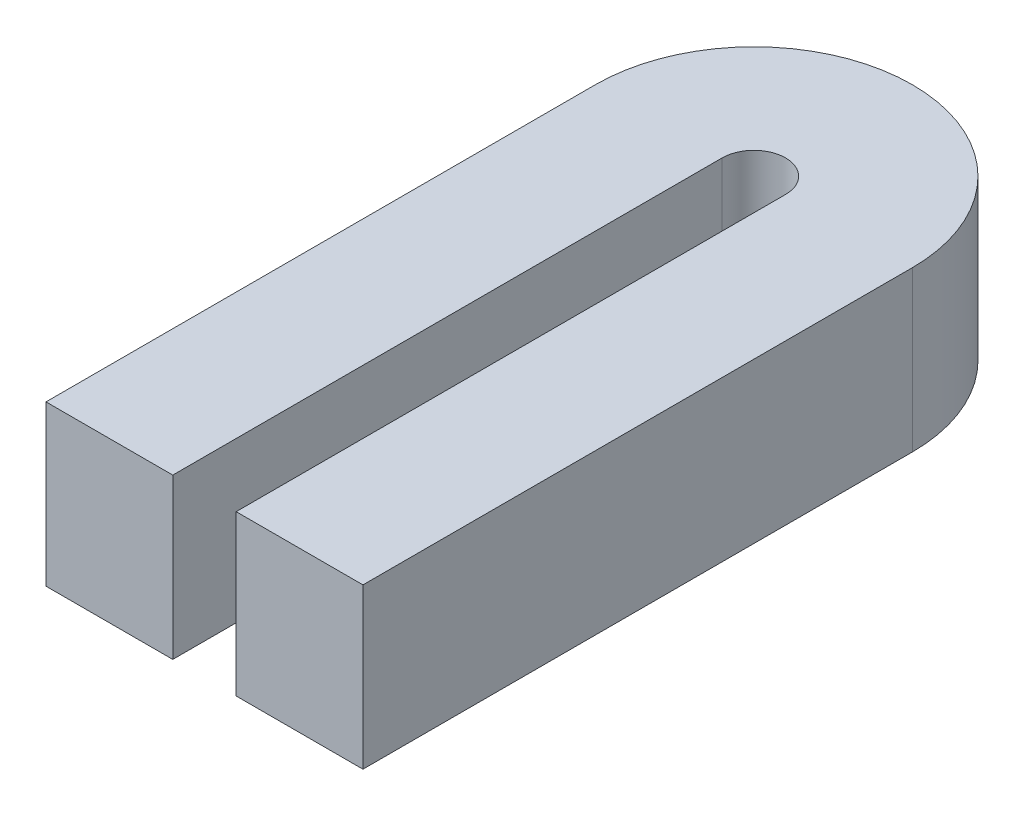
ISO-10303-21;
HEADER;
FILE_DESCRIPTION(('STEP AP214'),'2;1');
FILE_NAME('part.step','',(''),(''),'','','');
FILE_SCHEMA(('AUTOMOTIVE_DESIGN { 1 0 10303 214 1 1 1 1 }'));
ENDSEC;
DATA;
#1=APPLICATION_CONTEXT('core data for automotive mechanical design processes');
#2=APPLICATION_PROTOCOL_DEFINITION('international standard','automotive_design',2000,#1);
#3=PRODUCT_CONTEXT('',#1,'mechanical');
#4=PRODUCT('Part','Part','',(#3));
#5=PRODUCT_RELATED_PRODUCT_CATEGORY('part','',(#4));
#6=PRODUCT_DEFINITION_FORMATION('','',#4);
#7=PRODUCT_DEFINITION_CONTEXT('part definition',#1,'design');
#8=PRODUCT_DEFINITION('design','',#6,#7);
#9=PRODUCT_DEFINITION_SHAPE('','',#8);
#10=(LENGTH_UNIT() NAMED_UNIT(*) SI_UNIT(.MILLI.,.METRE.));
#11=(NAMED_UNIT(*) PLANE_ANGLE_UNIT() SI_UNIT($,.RADIAN.));
#12=(NAMED_UNIT(*) SI_UNIT($,.STERADIAN.) SOLID_ANGLE_UNIT());
#13=UNCERTAINTY_MEASURE_WITH_UNIT(LENGTH_MEASURE(1.E-05),#10,'distance_accuracy_value','');
#14=(GEOMETRIC_REPRESENTATION_CONTEXT(3) GLOBAL_UNCERTAINTY_ASSIGNED_CONTEXT((#13)) GLOBAL_UNIT_ASSIGNED_CONTEXT((#10,
#11,#12)) REPRESENTATION_CONTEXT('',''));
#15=CARTESIAN_POINT('',(0.,0.,0.));
#16=DIRECTION('',(0.,0.,1.));
#17=DIRECTION('',(1.,0.,0.));
#18=AXIS2_PLACEMENT_3D('',#15,#16,#17);
#19=CARTESIAN_POINT('',(1635.16573059091,-302.250162855083,2531.47329857861));
#20=DIRECTION('',(0.,-1.,0.));
#21=DIRECTION('',(0.,0.,-1.));
#22=AXIS2_PLACEMENT_3D('',#19,#20,#21);
#23=PLANE('',#22);
#24=DIRECTION('',(0.,0.,1.));
#25=VECTOR('',#24,1.);
#26=CARTESIAN_POINT('',(1611.5904596891,-302.250162855083,2531.47329857861));
#27=LINE('',#26,#25);
#28=CARTESIAN_POINT('',(1611.5904596891,-302.250162855083,2531.47329857861));
#29=VERTEX_POINT('',#28);
#30=CARTESIAN_POINT('',(1611.5904596891,-302.250162855083,2613.20090437155));
#31=VERTEX_POINT('',#30);
#32=EDGE_CURVE('E11',#29,#31,#27,.T.);
#33=ORIENTED_EDGE('',*,*,#32,.F.);
#34=CARTESIAN_POINT('',(1635.16573059091,-302.250162855083,2531.47329857861));
#35=DIRECTION('',(0.,-1.,0.));
#36=DIRECTION('',(1.,0.,0.));
#37=AXIS2_PLACEMENT_3D('',#34,#35,#36);
#38=CIRCLE('',#37,23.5752709018111);
#39=CARTESIAN_POINT('',(1658.74100149272,-302.250162855083,2531.47329857861));
#40=VERTEX_POINT('',#39);
#41=EDGE_CURVE('E86',#29,#40,#38,.T.);
#42=ORIENTED_EDGE('',*,*,#41,.T.);
#43=DIRECTION('',(0.,0.,1.));
#44=VECTOR('',#43,1.);
#45=CARTESIAN_POINT('',(1658.74100149272,-302.250162855083,2531.47329857861));
#46=LINE('',#45,#44);
#47=CARTESIAN_POINT('',(1658.74100149272,-302.250162855083,2613.20090437155));
#48=VERTEX_POINT('',#47);
#49=EDGE_CURVE('E82',#40,#48,#46,.T.);
#50=ORIENTED_EDGE('',*,*,#49,.T.);
#51=DIRECTION('',(1.,0.,0.));
#52=VECTOR('',#51,1.);
#53=CARTESIAN_POINT('',(1639.88078477127,-302.250162855083,2613.20090437155));
#54=LINE('',#53,#52);
#55=CARTESIAN_POINT('',(1639.88078477127,-302.250162855083,2613.20090437155));
#56=VERTEX_POINT('',#55);
#57=EDGE_CURVE('E98',#56,#48,#54,.T.);
#58=ORIENTED_EDGE('',*,*,#57,.F.);
#59=DIRECTION('',(0.,0.,1.));
#60=VECTOR('',#59,1.);
#61=CARTESIAN_POINT('',(1639.88078477127,-302.250162855083,2531.47329857861));
#62=LINE('',#61,#60);
#63=CARTESIAN_POINT('',(1639.88078477127,-302.250162855083,2531.47329857861));
#64=VERTEX_POINT('',#63);
#65=EDGE_CURVE('E95',#64,#56,#62,.T.);
#66=ORIENTED_EDGE('',*,*,#65,.F.);
#67=CARTESIAN_POINT('',(1635.16573059091,-302.250162855083,2531.47329857861));
#68=DIRECTION('',(0.,-1.,0.));
#69=DIRECTION('',(1.,0.,0.));
#70=AXIS2_PLACEMENT_3D('',#67,#68,#69);
#71=CIRCLE('',#70,4.71505418036223);
#72=CARTESIAN_POINT('',(1630.45067641054,-302.250162855083,2531.47329857861));
#73=VERTEX_POINT('',#72);
#74=EDGE_CURVE('E71',#73,#64,#71,.T.);
#75=ORIENTED_EDGE('',*,*,#74,.F.);
#76=DIRECTION('',(0.,0.,1.));
#77=VECTOR('',#76,1.);
#78=CARTESIAN_POINT('',(1630.45067641054,-302.250162855083,2531.47329857861));
#79=LINE('',#78,#77);
#80=CARTESIAN_POINT('',(1630.45067641054,-302.250162855083,2613.20090437155));
#81=VERTEX_POINT('',#80);
#82=EDGE_CURVE('E63',#73,#81,#79,.T.);
#83=ORIENTED_EDGE('',*,*,#82,.T.);
#84=DIRECTION('',(1.,0.,0.));
#85=VECTOR('',#84,1.);
#86=CARTESIAN_POINT('',(1611.5904596891,-302.250162855083,2613.20090437155));
#87=LINE('',#86,#85);
#88=EDGE_CURVE('E74',#31,#81,#87,.T.);
#89=ORIENTED_EDGE('',*,*,#88,.F.);
#90=EDGE_LOOP('',(#33,#42,#50,#58,#66,#75,#83,#89));
#91=FACE_BOUND('',#90,.T.);
#92=ADVANCED_FACE('F16',(#91),#23,.T.);
#93=CARTESIAN_POINT('',(1635.16573059091,-282.250162855083,2531.47329857861));
#94=DIRECTION('',(0.,-1.,0.));
#95=DIRECTION('',(0.,0.,-1.));
#96=AXIS2_PLACEMENT_3D('',#93,#94,#95);
#97=CYLINDRICAL_SURFACE('',#96,23.5752709018111);
#98=DIRECTION('',(0.,-1.,0.));
#99=VECTOR('',#98,1.);
#100=CARTESIAN_POINT('',(1611.5904596891,-282.250162855083,2531.47329857861));
#101=LINE('',#100,#99);
#102=CARTESIAN_POINT('',(1611.5904596891,-278.499891429945,2531.47329857861));
#103=VERTEX_POINT('',#102);
#104=EDGE_CURVE('E25',#103,#29,#101,.T.);
#105=ORIENTED_EDGE('',*,*,#104,.F.);
#106=CARTESIAN_POINT('',(1635.16573059091,-278.499891429945,2531.47329857861));
#107=DIRECTION('',(0.,1.,0.));
#108=DIRECTION('',(0.,0.,-1.));
#109=AXIS2_PLACEMENT_3D('',#106,#107,#108);
#110=CIRCLE('',#109,23.5752709018111);
#111=CARTESIAN_POINT('',(1658.74100149272,-278.499891429945,2531.47329857861));
#112=VERTEX_POINT('',#111);
#113=EDGE_CURVE('E146',#112,#103,#110,.T.);
#114=ORIENTED_EDGE('',*,*,#113,.F.);
#115=DIRECTION('',(0.,-1.,0.));
#116=VECTOR('',#115,1.);
#117=CARTESIAN_POINT('',(1658.74100149272,-282.250162855083,2531.47329857861));
#118=LINE('',#117,#116);
#119=EDGE_CURVE('E19',#112,#40,#118,.T.);
#120=ORIENTED_EDGE('',*,*,#119,.T.);
#121=ORIENTED_EDGE('',*,*,#41,.F.);
#122=EDGE_LOOP('',(#105,#114,#120,#121));
#123=FACE_BOUND('',#122,.T.);
#124=ADVANCED_FACE('F162',(#123),#97,.T.);
#125=CARTESIAN_POINT('',(1658.74100149272,-282.250162855083,2531.47329857861));
#126=DIRECTION('',(1.,0.,0.));
#127=DIRECTION('',(0.,0.,-1.));
#128=AXIS2_PLACEMENT_3D('',#125,#126,#127);
#129=PLANE('',#128);
#130=ORIENTED_EDGE('',*,*,#119,.F.);
#131=DIRECTION('',(0.,0.,-1.));
#132=VECTOR('',#131,1.);
#133=CARTESIAN_POINT('',(1658.74100149272,-278.499891429946,2613.20090437155));
#134=LINE('',#133,#132);
#135=CARTESIAN_POINT('',(1658.74100149272,-278.499891429946,2613.20090437155));
#136=VERTEX_POINT('',#135);
#137=EDGE_CURVE('E110',#136,#112,#134,.T.);
#138=ORIENTED_EDGE('',*,*,#137,.F.);
#139=DIRECTION('',(0.,-1.,0.));
#140=VECTOR('',#139,1.);
#141=CARTESIAN_POINT('',(1658.74100149272,-282.250162855083,2613.20090437155));
#142=LINE('',#141,#140);
#143=EDGE_CURVE('E84',#136,#48,#142,.T.);
#144=ORIENTED_EDGE('',*,*,#143,.T.);
#145=ORIENTED_EDGE('',*,*,#49,.F.);
#146=EDGE_LOOP('',(#130,#138,#144,#145));
#147=FACE_BOUND('',#146,.T.);
#148=ADVANCED_FACE('F106',(#147),#129,.T.);
#149=CARTESIAN_POINT('',(1639.88078477127,-282.250162855083,2613.20090437155));
#150=DIRECTION('',(0.,0.,-1.));
#151=DIRECTION('',(-1.,0.,0.));
#152=AXIS2_PLACEMENT_3D('',#149,#150,#151);
#153=PLANE('',#152);
#154=ORIENTED_EDGE('',*,*,#143,.F.);
#155=DIRECTION('',(1.,0.,0.));
#156=VECTOR('',#155,1.);
#157=CARTESIAN_POINT('',(1639.88078477127,-278.499891429946,2613.20090437155));
#158=LINE('',#157,#156);
#159=CARTESIAN_POINT('',(1639.88078477127,-278.499891429946,2613.20090437155));
#160=VERTEX_POINT('',#159);
#161=EDGE_CURVE('E150',#160,#136,#158,.T.);
#162=ORIENTED_EDGE('',*,*,#161,.F.);
#163=DIRECTION('',(0.,-1.,0.));
#164=VECTOR('',#163,1.);
#165=CARTESIAN_POINT('',(1639.88078477127,-282.250162855083,2613.20090437155));
#166=LINE('',#165,#164);
#167=EDGE_CURVE('E99',#160,#56,#166,.T.);
#168=ORIENTED_EDGE('',*,*,#167,.T.);
#169=ORIENTED_EDGE('',*,*,#57,.T.);
#170=EDGE_LOOP('',(#154,#162,#168,#169));
#171=FACE_BOUND('',#170,.T.);
#172=ADVANCED_FACE('F115',(#171),#153,.F.);
#173=CARTESIAN_POINT('',(1639.88078477127,-282.250162855083,2531.47329857861));
#174=DIRECTION('',(1.,0.,0.));
#175=DIRECTION('',(0.,0.,-1.));
#176=AXIS2_PLACEMENT_3D('',#173,#174,#175);
#177=PLANE('',#176);
#178=ORIENTED_EDGE('',*,*,#167,.F.);
#179=DIRECTION('',(0.,0.,1.));
#180=VECTOR('',#179,1.);
#181=CARTESIAN_POINT('',(1639.88078477127,-278.499891429945,2531.47329857861));
#182=LINE('',#181,#180);
#183=CARTESIAN_POINT('',(1639.88078477127,-278.499891429953,2531.47329857861));
#184=VERTEX_POINT('',#183);
#185=EDGE_CURVE('E121',#184,#160,#182,.T.);
#186=ORIENTED_EDGE('',*,*,#185,.F.);
#187=DIRECTION('',(0.,-1.,0.));
#188=VECTOR('',#187,1.);
#189=CARTESIAN_POINT('',(1639.88078477127,-282.250162855083,2531.47329857861));
#190=LINE('',#189,#188);
#191=EDGE_CURVE('E96',#184,#64,#190,.T.);
#192=ORIENTED_EDGE('',*,*,#191,.T.);
#193=ORIENTED_EDGE('',*,*,#65,.T.);
#194=EDGE_LOOP('',(#178,#186,#192,#193));
#195=FACE_BOUND('',#194,.T.);
#196=ADVANCED_FACE('F127',(#195),#177,.F.);
#197=CARTESIAN_POINT('',(1635.16573059091,-282.250162855083,2531.47329857861));
#198=DIRECTION('',(0.,-1.,0.));
#199=DIRECTION('',(0.,0.,-1.));
#200=AXIS2_PLACEMENT_3D('',#197,#198,#199);
#201=CYLINDRICAL_SURFACE('',#200,4.71505418036223);
#202=ORIENTED_EDGE('',*,*,#191,.F.);
#203=CARTESIAN_POINT('',(1635.16573059091,-278.499891429953,2531.47329857861));
#204=DIRECTION('',(0.,-1.,0.));
#205=DIRECTION('',(0.,0.,-1.));
#206=AXIS2_PLACEMENT_3D('',#203,#204,#205);
#207=CIRCLE('',#206,4.71505418036223);
#208=CARTESIAN_POINT('',(1630.45067641054,-278.499891429945,2531.47329857861));
#209=VERTEX_POINT('',#208);
#210=EDGE_CURVE('E124',#209,#184,#207,.T.);
#211=ORIENTED_EDGE('',*,*,#210,.F.);
#212=DIRECTION('',(0.,-1.,0.));
#213=VECTOR('',#212,1.);
#214=CARTESIAN_POINT('',(1630.45067641054,-282.250162855083,2531.47329857861));
#215=LINE('',#214,#213);
#216=EDGE_CURVE('E93',#209,#73,#215,.T.);
#217=ORIENTED_EDGE('',*,*,#216,.T.);
#218=ORIENTED_EDGE('',*,*,#74,.T.);
#219=EDGE_LOOP('',(#202,#211,#217,#218));
#220=FACE_BOUND('',#219,.T.);
#221=ADVANCED_FACE('F134',(#220),#201,.F.);
#222=CARTESIAN_POINT('',(1630.45067641054,-282.250162855083,2531.47329857861));
#223=DIRECTION('',(1.,0.,0.));
#224=DIRECTION('',(0.,0.,-1.));
#225=AXIS2_PLACEMENT_3D('',#222,#223,#224);
#226=PLANE('',#225);
#227=ORIENTED_EDGE('',*,*,#216,.F.);
#228=DIRECTION('',(0.,0.,-1.));
#229=VECTOR('',#228,1.);
#230=CARTESIAN_POINT('',(1630.45067641054,-278.499891429946,2613.20090437155));
#231=LINE('',#230,#229);
#232=CARTESIAN_POINT('',(1630.45067641054,-278.499891429946,2613.20090437155));
#233=VERTEX_POINT('',#232);
#234=EDGE_CURVE('E66',#233,#209,#231,.T.);
#235=ORIENTED_EDGE('',*,*,#234,.F.);
#236=DIRECTION('',(0.,-1.,0.));
#237=VECTOR('',#236,1.);
#238=CARTESIAN_POINT('',(1630.45067641054,-282.250162855083,2613.20090437155));
#239=LINE('',#238,#237);
#240=EDGE_CURVE('E58',#233,#81,#239,.T.);
#241=ORIENTED_EDGE('',*,*,#240,.T.);
#242=ORIENTED_EDGE('',*,*,#82,.F.);
#243=EDGE_LOOP('',(#227,#235,#241,#242));
#244=FACE_BOUND('',#243,.T.);
#245=ADVANCED_FACE('F61',(#244),#226,.T.);
#246=CARTESIAN_POINT('',(1611.5904596891,-282.250162855083,2613.20090437155));
#247=DIRECTION('',(0.,0.,-1.));
#248=DIRECTION('',(-1.,0.,0.));
#249=AXIS2_PLACEMENT_3D('',#246,#247,#248);
#250=PLANE('',#249);
#251=ORIENTED_EDGE('',*,*,#240,.F.);
#252=DIRECTION('',(1.,0.,0.));
#253=VECTOR('',#252,1.);
#254=CARTESIAN_POINT('',(1611.5904596891,-278.499891429946,2613.20090437155));
#255=LINE('',#254,#253);
#256=CARTESIAN_POINT('',(1611.5904596891,-278.499891429946,2613.20090437155));
#257=VERTEX_POINT('',#256);
#258=EDGE_CURVE('E139',#257,#233,#255,.T.);
#259=ORIENTED_EDGE('',*,*,#258,.F.);
#260=DIRECTION('',(0.,-1.,0.));
#261=VECTOR('',#260,1.);
#262=CARTESIAN_POINT('',(1611.5904596891,-282.250162855083,2613.20090437155));
#263=LINE('',#262,#261);
#264=EDGE_CURVE('E70',#257,#31,#263,.T.);
#265=ORIENTED_EDGE('',*,*,#264,.T.);
#266=ORIENTED_EDGE('',*,*,#88,.T.);
#267=EDGE_LOOP('',(#251,#259,#265,#266));
#268=FACE_BOUND('',#267,.T.);
#269=ADVANCED_FACE('F75',(#268),#250,.F.);
#270=CARTESIAN_POINT('',(1611.5904596891,-282.250162855083,2531.47329857861));
#271=DIRECTION('',(1.,0.,0.));
#272=DIRECTION('',(0.,0.,-1.));
#273=AXIS2_PLACEMENT_3D('',#270,#271,#272);
#274=PLANE('',#273);
#275=ORIENTED_EDGE('',*,*,#264,.F.);
#276=DIRECTION('',(0.,0.,1.));
#277=VECTOR('',#276,1.);
#278=CARTESIAN_POINT('',(1611.5904596891,-278.499891429945,2531.47329857861));
#279=LINE('',#278,#277);
#280=EDGE_CURVE('E142',#103,#257,#279,.T.);
#281=ORIENTED_EDGE('',*,*,#280,.F.);
#282=ORIENTED_EDGE('',*,*,#104,.T.);
#283=ORIENTED_EDGE('',*,*,#32,.T.);
#284=EDGE_LOOP('',(#275,#281,#282,#283));
#285=FACE_BOUND('',#284,.T.);
#286=ADVANCED_FACE('F161',(#285),#274,.F.);
#287=CARTESIAN_POINT('',(1635.16573059091,-278.499891429945,2531.47329857861));
#288=DIRECTION('',(0.,1.,0.));
#289=DIRECTION('',(0.,0.,1.));
#290=AXIS2_PLACEMENT_3D('',#287,#288,#289);
#291=PLANE('',#290);
#292=ORIENTED_EDGE('',*,*,#161,.T.);
#293=ORIENTED_EDGE('',*,*,#137,.T.);
#294=ORIENTED_EDGE('',*,*,#113,.T.);
#295=ORIENTED_EDGE('',*,*,#280,.T.);
#296=ORIENTED_EDGE('',*,*,#258,.T.);
#297=ORIENTED_EDGE('',*,*,#234,.T.);
#298=ORIENTED_EDGE('',*,*,#210,.T.);
#299=ORIENTED_EDGE('',*,*,#185,.T.);
#300=EDGE_LOOP('',(#292,#293,#294,#295,#296,#297,#298,#299));
#301=FACE_BOUND('',#300,.T.);
#302=ADVANCED_FACE('F137',(#301),#291,.T.);
#303=CLOSED_SHELL('',(#92,#124,#148,#172,#196,#221,#245,#269,#286,#302));
#304=MANIFOLD_SOLID_BREP('B1',#303);
#305=ADVANCED_BREP_SHAPE_REPRESENTATION('',(#18,#304),#14);
#306=SHAPE_DEFINITION_REPRESENTATION(#9,#305);
ENDSEC;
END-ISO-10303-21;
